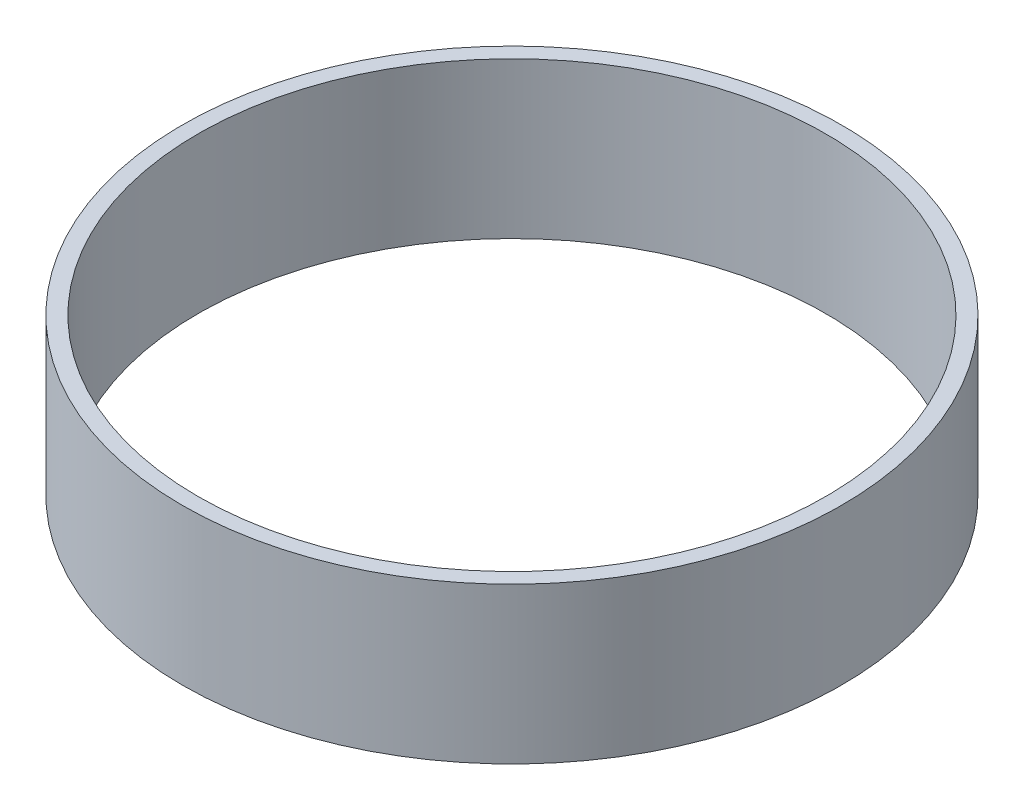
ISO-10303-21;
HEADER;
FILE_DESCRIPTION(('STEP AP214'),'2;1');
FILE_NAME('part.step','',(''),(''),'','','');
FILE_SCHEMA(('AUTOMOTIVE_DESIGN { 1 0 10303 214 1 1 1 1 }'));
ENDSEC;
DATA;
#1=APPLICATION_CONTEXT('core data for automotive mechanical design processes');
#2=APPLICATION_PROTOCOL_DEFINITION('international standard','automotive_design',2000,#1);
#3=PRODUCT_CONTEXT('',#1,'mechanical');
#4=PRODUCT('Part','Part','',(#3));
#5=PRODUCT_RELATED_PRODUCT_CATEGORY('part','',(#4));
#6=PRODUCT_DEFINITION_FORMATION('','',#4);
#7=PRODUCT_DEFINITION_CONTEXT('part definition',#1,'design');
#8=PRODUCT_DEFINITION('design','',#6,#7);
#9=PRODUCT_DEFINITION_SHAPE('','',#8);
#10=(LENGTH_UNIT() NAMED_UNIT(*) SI_UNIT(.MILLI.,.METRE.));
#11=(NAMED_UNIT(*) PLANE_ANGLE_UNIT() SI_UNIT($,.RADIAN.));
#12=(NAMED_UNIT(*) SI_UNIT($,.STERADIAN.) SOLID_ANGLE_UNIT());
#13=UNCERTAINTY_MEASURE_WITH_UNIT(LENGTH_MEASURE(1.E-05),#10,'distance_accuracy_value','');
#14=(GEOMETRIC_REPRESENTATION_CONTEXT(3) GLOBAL_UNCERTAINTY_ASSIGNED_CONTEXT((#13)) GLOBAL_UNIT_ASSIGNED_CONTEXT((#10,
#11,#12)) REPRESENTATION_CONTEXT('',''));
#15=CARTESIAN_POINT('',(0.,0.,0.));
#16=DIRECTION('',(0.,0.,1.));
#17=DIRECTION('',(1.,0.,0.));
#18=AXIS2_PLACEMENT_3D('',#15,#16,#17);
#19=CARTESIAN_POINT('',(0.,7.5,0.));
#20=DIRECTION('',(0.,1.,0.));
#21=DIRECTION('',(0.,0.,1.));
#22=AXIS2_PLACEMENT_3D('',#19,#20,#21);
#23=PLANE('',#22);
#24=CARTESIAN_POINT('',(0.,7.5,0.));
#25=DIRECTION('',(0.,1.,0.));
#26=DIRECTION('',(0.,0.,1.));
#27=AXIS2_PLACEMENT_3D('',#24,#25,#26);
#28=CIRCLE('',#27,31.75);
#29=CARTESIAN_POINT('',(0.,7.5,31.75));
#30=VERTEX_POINT('',#29);
#31=EDGE_CURVE('E10',#30,#30,#28,.T.);
#32=ORIENTED_EDGE('',*,*,#31,.T.);
#33=EDGE_LOOP('',(#32));
#34=FACE_BOUND('',#33,.T.);
#35=CARTESIAN_POINT('',(0.,7.5,0.));
#36=DIRECTION('',(0.,1.,0.));
#37=DIRECTION('',(0.,0.,1.));
#38=AXIS2_PLACEMENT_3D('',#35,#36,#37);
#39=CIRCLE('',#38,30.25);
#40=CARTESIAN_POINT('',(0.,7.5,30.25));
#41=VERTEX_POINT('',#40);
#42=EDGE_CURVE('E42',#41,#41,#39,.T.);
#43=ORIENTED_EDGE('',*,*,#42,.F.);
#44=EDGE_LOOP('',(#43));
#45=FACE_BOUND('',#44,.T.);
#46=ADVANCED_FACE('F31',(#34,#45),#23,.T.);
#47=CARTESIAN_POINT('',(0.,-7.5,0.));
#48=DIRECTION('',(0.,1.,0.));
#49=DIRECTION('',(0.,0.,1.));
#50=AXIS2_PLACEMENT_3D('',#47,#48,#49);
#51=PLANE('',#50);
#52=CARTESIAN_POINT('',(0.,-7.5,0.));
#53=DIRECTION('',(0.,1.,0.));
#54=DIRECTION('',(0.,0.,1.));
#55=AXIS2_PLACEMENT_3D('',#52,#53,#54);
#56=CIRCLE('',#55,31.75);
#57=CARTESIAN_POINT('',(0.,-7.5,31.75));
#58=VERTEX_POINT('',#57);
#59=EDGE_CURVE('E35',#58,#58,#56,.T.);
#60=ORIENTED_EDGE('',*,*,#59,.F.);
#61=EDGE_LOOP('',(#60));
#62=FACE_BOUND('',#61,.T.);
#63=CARTESIAN_POINT('',(0.,-7.5,0.));
#64=DIRECTION('',(0.,1.,0.));
#65=DIRECTION('',(0.,0.,1.));
#66=AXIS2_PLACEMENT_3D('',#63,#64,#65);
#67=CIRCLE('',#66,30.25);
#68=CARTESIAN_POINT('',(0.,-7.5,30.25));
#69=VERTEX_POINT('',#68);
#70=EDGE_CURVE('E44',#69,#69,#67,.T.);
#71=ORIENTED_EDGE('',*,*,#70,.T.);
#72=EDGE_LOOP('',(#71));
#73=FACE_BOUND('',#72,.T.);
#74=ADVANCED_FACE('F54',(#62,#73),#51,.F.);
#75=CARTESIAN_POINT('',(0.,7.5,0.));
#76=DIRECTION('',(0.,-1.,0.));
#77=DIRECTION('',(0.,0.,-1.));
#78=AXIS2_PLACEMENT_3D('',#75,#76,#77);
#79=CYLINDRICAL_SURFACE('',#78,31.75);
#80=ORIENTED_EDGE('',*,*,#31,.F.);
#81=EDGE_LOOP('',(#80));
#82=FACE_BOUND('',#81,.T.);
#83=ORIENTED_EDGE('',*,*,#59,.T.);
#84=EDGE_LOOP('',(#83));
#85=FACE_BOUND('',#84,.T.);
#86=ADVANCED_FACE('F33',(#82,#85),#79,.T.);
#87=CARTESIAN_POINT('',(0.,7.5,0.));
#88=DIRECTION('',(0.,-1.,0.));
#89=DIRECTION('',(0.,0.,-1.));
#90=AXIS2_PLACEMENT_3D('',#87,#88,#89);
#91=CYLINDRICAL_SURFACE('',#90,30.25);
#92=ORIENTED_EDGE('',*,*,#42,.T.);
#93=EDGE_LOOP('',(#92));
#94=FACE_BOUND('',#93,.T.);
#95=ORIENTED_EDGE('',*,*,#70,.F.);
#96=EDGE_LOOP('',(#95));
#97=FACE_BOUND('',#96,.T.);
#98=ADVANCED_FACE('F50',(#94,#97),#91,.F.);
#99=CLOSED_SHELL('',(#46,#74,#86,#98));
#100=MANIFOLD_SOLID_BREP('B2',#99);
#101=ADVANCED_BREP_SHAPE_REPRESENTATION('',(#18,#100),#14);
#102=SHAPE_DEFINITION_REPRESENTATION(#9,#101);
ENDSEC;
END-ISO-10303-21;
